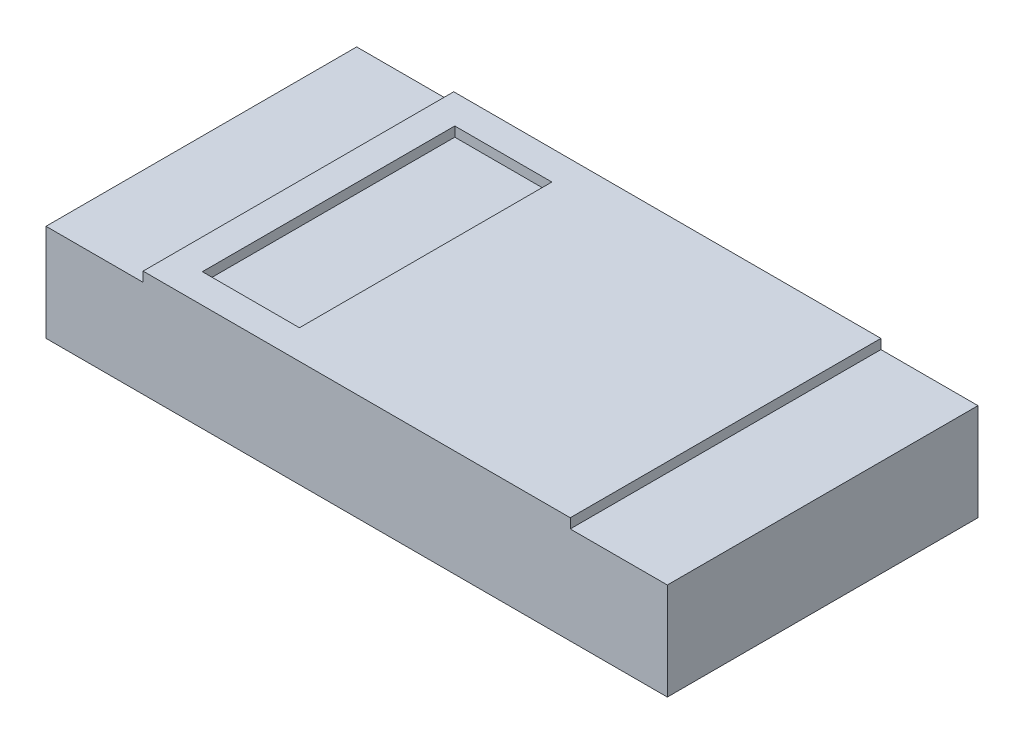
ISO-10303-21;
HEADER;
FILE_DESCRIPTION(('STEP AP214'),'2;1');
FILE_NAME('part.step','',(''),(''),'','','');
FILE_SCHEMA(('AUTOMOTIVE_DESIGN { 1 0 10303 214 1 1 1 1 }'));
ENDSEC;
DATA;
#1=APPLICATION_CONTEXT('core data for automotive mechanical design processes');
#2=APPLICATION_PROTOCOL_DEFINITION('international standard','automotive_design',2000,#1);
#3=PRODUCT_CONTEXT('',#1,'mechanical');
#4=PRODUCT('Part','Part','',(#3));
#5=PRODUCT_RELATED_PRODUCT_CATEGORY('part','',(#4));
#6=PRODUCT_DEFINITION_FORMATION('','',#4);
#7=PRODUCT_DEFINITION_CONTEXT('part definition',#1,'design');
#8=PRODUCT_DEFINITION('design','',#6,#7);
#9=PRODUCT_DEFINITION_SHAPE('','',#8);
#10=(LENGTH_UNIT() NAMED_UNIT(*) SI_UNIT(.MILLI.,.METRE.));
#11=(NAMED_UNIT(*) PLANE_ANGLE_UNIT() SI_UNIT($,.RADIAN.));
#12=(NAMED_UNIT(*) SI_UNIT($,.STERADIAN.) SOLID_ANGLE_UNIT());
#13=UNCERTAINTY_MEASURE_WITH_UNIT(LENGTH_MEASURE(1.E-05),#10,'distance_accuracy_value','');
#14=(GEOMETRIC_REPRESENTATION_CONTEXT(3) GLOBAL_UNCERTAINTY_ASSIGNED_CONTEXT((#13)) GLOBAL_UNIT_ASSIGNED_CONTEXT((#10,
#11,#12)) REPRESENTATION_CONTEXT('',''));
#15=CARTESIAN_POINT('',(0.,0.,0.));
#16=DIRECTION('',(0.,0.,1.));
#17=DIRECTION('',(1.,0.,0.));
#18=AXIS2_PLACEMENT_3D('',#15,#16,#17);
#19=CARTESIAN_POINT('',(0.,0.5,0.));
#20=DIRECTION('',(0.,-1.,0.));
#21=DIRECTION('',(0.,0.,-1.));
#22=AXIS2_PLACEMENT_3D('',#19,#20,#21);
#23=PLANE('',#22);
#24=DIRECTION('',(0.,0.,1.));
#25=VECTOR('',#24,1.);
#26=CARTESIAN_POINT('',(-1.1,0.5,-0.8));
#27=LINE('',#26,#25);
#28=CARTESIAN_POINT('',(-1.1,0.5,-0.8));
#29=VERTEX_POINT('',#28);
#30=CARTESIAN_POINT('',(-1.1,0.5,0.8));
#31=VERTEX_POINT('',#30);
#32=EDGE_CURVE('E176',#29,#31,#27,.T.);
#33=ORIENTED_EDGE('',*,*,#32,.F.);
#34=DIRECTION('',(-1.,0.,0.));
#35=VECTOR('',#34,1.);
#36=CARTESIAN_POINT('',(-1.6,0.5,-0.8));
#37=LINE('',#36,#35);
#38=CARTESIAN_POINT('',(-1.6,0.5,-0.8));
#39=VERTEX_POINT('',#38);
#40=EDGE_CURVE('E221',#29,#39,#37,.T.);
#41=ORIENTED_EDGE('',*,*,#40,.T.);
#42=DIRECTION('',(0.,0.,1.));
#43=VECTOR('',#42,1.);
#44=CARTESIAN_POINT('',(-1.6,0.5,0.8));
#45=LINE('',#44,#43);
#46=CARTESIAN_POINT('',(-1.6,0.5,0.8));
#47=VERTEX_POINT('',#46);
#48=EDGE_CURVE('E226',#39,#47,#45,.T.);
#49=ORIENTED_EDGE('',*,*,#48,.T.);
#50=DIRECTION('',(1.,0.,0.));
#51=VECTOR('',#50,1.);
#52=CARTESIAN_POINT('',(-1.6,0.5,0.8));
#53=LINE('',#52,#51);
#54=EDGE_CURVE('E230',#47,#31,#53,.T.);
#55=ORIENTED_EDGE('',*,*,#54,.T.);
#56=EDGE_LOOP('',(#33,#41,#49,#55));
#57=FACE_BOUND('',#56,.T.);
#58=ADVANCED_FACE('F41',(#57),#23,.F.);
#59=DIRECTION('',(0.,0.,-1.));
#60=VECTOR('',#59,1.);
#61=CARTESIAN_POINT('',(1.1,0.5,-0.800000000000001));
#62=LINE('',#61,#60);
#63=CARTESIAN_POINT('',(1.1,0.5,0.8));
#64=VERTEX_POINT('',#63);
#65=CARTESIAN_POINT('',(1.1,0.5,-0.800000000000001));
#66=VERTEX_POINT('',#65);
#67=EDGE_CURVE('E65',#64,#66,#62,.T.);
#68=ORIENTED_EDGE('',*,*,#67,.F.);
#69=CARTESIAN_POINT('',(1.6,0.5,0.8));
#70=VERTEX_POINT('',#69);
#71=EDGE_CURVE('E229',#64,#70,#53,.T.);
#72=ORIENTED_EDGE('',*,*,#71,.T.);
#73=DIRECTION('',(0.,0.,-1.));
#74=VECTOR('',#73,1.);
#75=CARTESIAN_POINT('',(1.6,0.5,0.8));
#76=LINE('',#75,#74);
#77=CARTESIAN_POINT('',(1.6,0.5,-0.8));
#78=VERTEX_POINT('',#77);
#79=EDGE_CURVE('E217',#70,#78,#76,.T.);
#80=ORIENTED_EDGE('',*,*,#79,.T.);
#81=EDGE_CURVE('E223',#78,#66,#37,.T.);
#82=ORIENTED_EDGE('',*,*,#81,.T.);
#83=EDGE_LOOP('',(#68,#72,#80,#82));
#84=FACE_BOUND('',#83,.T.);
#85=ADVANCED_FACE('F272',(#84),#23,.F.);
#86=CARTESIAN_POINT('',(1.6,0.5,0.8));
#87=DIRECTION('',(-1.,0.,0.));
#88=DIRECTION('',(0.,0.,1.));
#89=AXIS2_PLACEMENT_3D('',#86,#87,#88);
#90=PLANE('',#89);
#91=DIRECTION('',(0.,0.,-1.));
#92=VECTOR('',#91,1.);
#93=CARTESIAN_POINT('',(1.6,0.,0.8));
#94=LINE('',#93,#92);
#95=CARTESIAN_POINT('',(1.6,0.,0.8));
#96=VERTEX_POINT('',#95);
#97=CARTESIAN_POINT('',(1.6,0.,-0.8));
#98=VERTEX_POINT('',#97);
#99=EDGE_CURVE('E216',#96,#98,#94,.T.);
#100=ORIENTED_EDGE('',*,*,#99,.T.);
#101=DIRECTION('',(0.,-1.,0.));
#102=VECTOR('',#101,1.);
#103=CARTESIAN_POINT('',(1.6,0.5,-0.8));
#104=LINE('',#103,#102);
#105=EDGE_CURVE('E11',#78,#98,#104,.T.);
#106=ORIENTED_EDGE('',*,*,#105,.F.);
#107=ORIENTED_EDGE('',*,*,#79,.F.);
#108=DIRECTION('',(0.,-1.,0.));
#109=VECTOR('',#108,1.);
#110=CARTESIAN_POINT('',(1.6,0.5,0.8));
#111=LINE('',#110,#109);
#112=EDGE_CURVE('E233',#70,#96,#111,.T.);
#113=ORIENTED_EDGE('',*,*,#112,.T.);
#114=EDGE_LOOP('',(#100,#106,#107,#113));
#115=FACE_BOUND('',#114,.T.);
#116=ADVANCED_FACE('F43',(#115),#90,.F.);
#117=CARTESIAN_POINT('',(-1.6,0.5,-0.8));
#118=DIRECTION('',(0.,0.,1.));
#119=DIRECTION('',(1.,0.,0.));
#120=AXIS2_PLACEMENT_3D('',#117,#118,#119);
#121=PLANE('',#120);
#122=DIRECTION('',(-1.,0.,0.));
#123=VECTOR('',#122,1.);
#124=CARTESIAN_POINT('',(-1.6,0.,-0.8));
#125=LINE('',#124,#123);
#126=CARTESIAN_POINT('',(-1.6,0.,-0.8));
#127=VERTEX_POINT('',#126);
#128=EDGE_CURVE('E237',#98,#127,#125,.T.);
#129=ORIENTED_EDGE('',*,*,#128,.T.);
#130=DIRECTION('',(0.,-1.,0.));
#131=VECTOR('',#130,1.);
#132=CARTESIAN_POINT('',(-1.6,0.5,-0.8));
#133=LINE('',#132,#131);
#134=EDGE_CURVE('E50',#39,#127,#133,.T.);
#135=ORIENTED_EDGE('',*,*,#134,.F.);
#136=ORIENTED_EDGE('',*,*,#40,.F.);
#137=DIRECTION('',(0.,-1.,0.));
#138=VECTOR('',#137,1.);
#139=CARTESIAN_POINT('',(-1.1,0.55,-0.8));
#140=LINE('',#139,#138);
#141=CARTESIAN_POINT('',(-1.1,0.55,-0.8));
#142=VERTEX_POINT('',#141);
#143=EDGE_CURVE('E195',#142,#29,#140,.T.);
#144=ORIENTED_EDGE('',*,*,#143,.F.);
#145=DIRECTION('',(-1.,0.,0.));
#146=VECTOR('',#145,1.);
#147=CARTESIAN_POINT('',(-1.1,0.55,-0.8));
#148=LINE('',#147,#146);
#149=CARTESIAN_POINT('',(1.1,0.55,-0.800000000000001));
#150=VERTEX_POINT('',#149);
#151=EDGE_CURVE('E192',#150,#142,#148,.T.);
#152=ORIENTED_EDGE('',*,*,#151,.F.);
#153=DIRECTION('',(0.,-1.,0.));
#154=VECTOR('',#153,1.);
#155=CARTESIAN_POINT('',(1.1,0.55,-0.800000000000001));
#156=LINE('',#155,#154);
#157=EDGE_CURVE('E204',#150,#66,#156,.T.);
#158=ORIENTED_EDGE('',*,*,#157,.T.);
#159=ORIENTED_EDGE('',*,*,#81,.F.);
#160=ORIENTED_EDGE('',*,*,#105,.T.);
#161=EDGE_LOOP('',(#129,#135,#136,#144,#152,#158,#159,#160));
#162=FACE_BOUND('',#161,.T.);
#163=ADVANCED_FACE('F278',(#162),#121,.F.);
#164=CARTESIAN_POINT('',(-1.6,0.5,0.8));
#165=DIRECTION('',(1.,0.,0.));
#166=DIRECTION('',(0.,0.,-1.));
#167=AXIS2_PLACEMENT_3D('',#164,#165,#166);
#168=PLANE('',#167);
#169=DIRECTION('',(0.,0.,1.));
#170=VECTOR('',#169,1.);
#171=CARTESIAN_POINT('',(-1.6,0.,0.8));
#172=LINE('',#171,#170);
#173=CARTESIAN_POINT('',(-1.6,0.,0.8));
#174=VERTEX_POINT('',#173);
#175=EDGE_CURVE('E240',#127,#174,#172,.T.);
#176=ORIENTED_EDGE('',*,*,#175,.T.);
#177=DIRECTION('',(0.,-1.,0.));
#178=VECTOR('',#177,1.);
#179=CARTESIAN_POINT('',(-1.6,0.5,0.8));
#180=LINE('',#179,#178);
#181=EDGE_CURVE('E248',#47,#174,#180,.T.);
#182=ORIENTED_EDGE('',*,*,#181,.F.);
#183=ORIENTED_EDGE('',*,*,#48,.F.);
#184=ORIENTED_EDGE('',*,*,#134,.T.);
#185=EDGE_LOOP('',(#176,#182,#183,#184));
#186=FACE_BOUND('',#185,.T.);
#187=ADVANCED_FACE('F257',(#186),#168,.F.);
#188=CARTESIAN_POINT('',(-1.6,0.5,0.8));
#189=DIRECTION('',(0.,0.,-1.));
#190=DIRECTION('',(-1.,0.,0.));
#191=AXIS2_PLACEMENT_3D('',#188,#189,#190);
#192=PLANE('',#191);
#193=DIRECTION('',(1.,0.,0.));
#194=VECTOR('',#193,1.);
#195=CARTESIAN_POINT('',(-1.6,0.,0.8));
#196=LINE('',#195,#194);
#197=EDGE_CURVE('E222',#174,#96,#196,.T.);
#198=ORIENTED_EDGE('',*,*,#197,.T.);
#199=ORIENTED_EDGE('',*,*,#112,.F.);
#200=ORIENTED_EDGE('',*,*,#71,.F.);
#201=DIRECTION('',(0.,-1.,0.));
#202=VECTOR('',#201,1.);
#203=CARTESIAN_POINT('',(1.1,0.55,0.8));
#204=LINE('',#203,#202);
#205=CARTESIAN_POINT('',(1.1,0.55,0.8));
#206=VERTEX_POINT('',#205);
#207=EDGE_CURVE('E208',#206,#64,#204,.T.);
#208=ORIENTED_EDGE('',*,*,#207,.F.);
#209=DIRECTION('',(1.,0.,0.));
#210=VECTOR('',#209,1.);
#211=CARTESIAN_POINT('',(-1.1,0.55,0.8));
#212=LINE('',#211,#210);
#213=CARTESIAN_POINT('',(-1.1,0.55,0.8));
#214=VERTEX_POINT('',#213);
#215=EDGE_CURVE('E186',#214,#206,#212,.T.);
#216=ORIENTED_EDGE('',*,*,#215,.F.);
#217=DIRECTION('',(0.,-1.,0.));
#218=VECTOR('',#217,1.);
#219=CARTESIAN_POINT('',(-1.1,0.55,0.8));
#220=LINE('',#219,#218);
#221=EDGE_CURVE('E212',#214,#31,#220,.T.);
#222=ORIENTED_EDGE('',*,*,#221,.T.);
#223=ORIENTED_EDGE('',*,*,#54,.F.);
#224=ORIENTED_EDGE('',*,*,#181,.T.);
#225=EDGE_LOOP('',(#198,#199,#200,#208,#216,#222,#223,#224));
#226=FACE_BOUND('',#225,.T.);
#227=ADVANCED_FACE('F267',(#226),#192,.F.);
#228=CARTESIAN_POINT('',(0.,0.,0.));
#229=DIRECTION('',(0.,-1.,0.));
#230=DIRECTION('',(0.,0.,-1.));
#231=AXIS2_PLACEMENT_3D('',#228,#229,#230);
#232=PLANE('',#231);
#233=ORIENTED_EDGE('',*,*,#99,.F.);
#234=ORIENTED_EDGE('',*,*,#197,.F.);
#235=ORIENTED_EDGE('',*,*,#175,.F.);
#236=ORIENTED_EDGE('',*,*,#128,.F.);
#237=EDGE_LOOP('',(#233,#234,#235,#236));
#238=FACE_BOUND('',#237,.T.);
#239=ADVANCED_FACE('F264',(#238),#232,.T.);
#240=CARTESIAN_POINT('',(-1.1,0.55,-0.8));
#241=DIRECTION('',(1.,0.,0.));
#242=DIRECTION('',(0.,0.,-1.));
#243=AXIS2_PLACEMENT_3D('',#240,#241,#242);
#244=PLANE('',#243);
#245=ORIENTED_EDGE('',*,*,#32,.T.);
#246=ORIENTED_EDGE('',*,*,#221,.F.);
#247=DIRECTION('',(0.,0.,1.));
#248=VECTOR('',#247,1.);
#249=CARTESIAN_POINT('',(-1.1,0.55,-0.8));
#250=LINE('',#249,#248);
#251=EDGE_CURVE('E182',#142,#214,#250,.T.);
#252=ORIENTED_EDGE('',*,*,#251,.F.);
#253=ORIENTED_EDGE('',*,*,#143,.T.);
#254=EDGE_LOOP('',(#245,#246,#252,#253));
#255=FACE_BOUND('',#254,.T.);
#256=ADVANCED_FACE('F282',(#255),#244,.F.);
#257=CARTESIAN_POINT('',(1.1,0.55,-0.800000000000001));
#258=DIRECTION('',(-1.,0.,0.));
#259=DIRECTION('',(0.,0.,1.));
#260=AXIS2_PLACEMENT_3D('',#257,#258,#259);
#261=PLANE('',#260);
#262=ORIENTED_EDGE('',*,*,#67,.T.);
#263=ORIENTED_EDGE('',*,*,#157,.F.);
#264=DIRECTION('',(0.,0.,-1.));
#265=VECTOR('',#264,1.);
#266=CARTESIAN_POINT('',(1.1,0.55,-0.800000000000001));
#267=LINE('',#266,#265);
#268=EDGE_CURVE('E189',#206,#150,#267,.T.);
#269=ORIENTED_EDGE('',*,*,#268,.F.);
#270=ORIENTED_EDGE('',*,*,#207,.T.);
#271=EDGE_LOOP('',(#262,#263,#269,#270));
#272=FACE_BOUND('',#271,.T.);
#273=ADVANCED_FACE('F289',(#272),#261,.F.);
#274=CARTESIAN_POINT('',(0.,0.55,0.));
#275=DIRECTION('',(0.,1.,0.));
#276=DIRECTION('',(0.,0.,1.));
#277=AXIS2_PLACEMENT_3D('',#274,#275,#276);
#278=PLANE('',#277);
#279=DIRECTION('',(0.,0.,1.));
#280=VECTOR('',#279,1.);
#281=CARTESIAN_POINT('',(-0.944727382755866,0.55,-0.65));
#282=LINE('',#281,#280);
#283=CARTESIAN_POINT('',(-0.944727382755866,0.55,-0.65));
#284=VERTEX_POINT('',#283);
#285=CARTESIAN_POINT('',(-0.944727382755866,0.55,0.65));
#286=VERTEX_POINT('',#285);
#287=EDGE_CURVE('E57',#284,#286,#282,.T.);
#288=ORIENTED_EDGE('',*,*,#287,.F.);
#289=DIRECTION('',(-1.,0.,0.));
#290=VECTOR('',#289,1.);
#291=CARTESIAN_POINT('',(-0.944727382755866,0.55,-0.65));
#292=LINE('',#291,#290);
#293=CARTESIAN_POINT('',(-0.444727382755866,0.55,-0.65));
#294=VERTEX_POINT('',#293);
#295=EDGE_CURVE('E154',#294,#284,#292,.T.);
#296=ORIENTED_EDGE('',*,*,#295,.F.);
#297=DIRECTION('',(0.,0.,-1.));
#298=VECTOR('',#297,1.);
#299=CARTESIAN_POINT('',(-0.444727382755866,0.55,-0.65));
#300=LINE('',#299,#298);
#301=CARTESIAN_POINT('',(-0.444727382755866,0.55,0.65));
#302=VERTEX_POINT('',#301);
#303=EDGE_CURVE('E158',#302,#294,#300,.T.);
#304=ORIENTED_EDGE('',*,*,#303,.F.);
#305=DIRECTION('',(1.,0.,0.));
#306=VECTOR('',#305,1.);
#307=CARTESIAN_POINT('',(-0.944727382755866,0.55,0.65));
#308=LINE('',#307,#306);
#309=EDGE_CURVE('E167',#286,#302,#308,.T.);
#310=ORIENTED_EDGE('',*,*,#309,.F.);
#311=EDGE_LOOP('',(#288,#296,#304,#310));
#312=FACE_BOUND('',#311,.T.);
#313=ORIENTED_EDGE('',*,*,#251,.T.);
#314=ORIENTED_EDGE('',*,*,#215,.T.);
#315=ORIENTED_EDGE('',*,*,#268,.T.);
#316=ORIENTED_EDGE('',*,*,#151,.T.);
#317=EDGE_LOOP('',(#313,#314,#315,#316));
#318=FACE_BOUND('',#317,.T.);
#319=ADVANCED_FACE('F285',(#312,#318),#278,.T.);
#320=CARTESIAN_POINT('',(-0.944727382755866,0.5,-0.65));
#321=DIRECTION('',(-1.,0.,0.));
#322=DIRECTION('',(0.,0.,1.));
#323=AXIS2_PLACEMENT_3D('',#320,#321,#322);
#324=PLANE('',#323);
#325=ORIENTED_EDGE('',*,*,#287,.T.);
#326=DIRECTION('',(0.,1.,0.));
#327=VECTOR('',#326,1.);
#328=CARTESIAN_POINT('',(-0.944727382755866,0.5,0.65));
#329=LINE('',#328,#327);
#330=CARTESIAN_POINT('',(-0.944727382755866,0.5,0.65));
#331=VERTEX_POINT('',#330);
#332=EDGE_CURVE('E129',#331,#286,#329,.T.);
#333=ORIENTED_EDGE('',*,*,#332,.F.);
#334=DIRECTION('',(0.,0.,1.));
#335=VECTOR('',#334,1.);
#336=CARTESIAN_POINT('',(-0.944727382755866,0.5,-0.65));
#337=LINE('',#336,#335);
#338=CARTESIAN_POINT('',(-0.944727382755866,0.5,-0.65));
#339=VERTEX_POINT('',#338);
#340=EDGE_CURVE('E133',#339,#331,#337,.T.);
#341=ORIENTED_EDGE('',*,*,#340,.F.);
#342=DIRECTION('',(0.,1.,0.));
#343=VECTOR('',#342,1.);
#344=CARTESIAN_POINT('',(-0.944727382755866,0.5,-0.65));
#345=LINE('',#344,#343);
#346=EDGE_CURVE('E173',#339,#284,#345,.T.);
#347=ORIENTED_EDGE('',*,*,#346,.T.);
#348=EDGE_LOOP('',(#325,#333,#341,#347));
#349=FACE_BOUND('',#348,.T.);
#350=ADVANCED_FACE('F131',(#349),#324,.F.);
#351=CARTESIAN_POINT('',(-0.944727382755866,0.5,-0.65));
#352=DIRECTION('',(0.,0.,-1.));
#353=DIRECTION('',(-1.,0.,0.));
#354=AXIS2_PLACEMENT_3D('',#351,#352,#353);
#355=PLANE('',#354);
#356=ORIENTED_EDGE('',*,*,#295,.T.);
#357=ORIENTED_EDGE('',*,*,#346,.F.);
#358=DIRECTION('',(-1.,0.,0.));
#359=VECTOR('',#358,1.);
#360=CARTESIAN_POINT('',(-0.944727382755866,0.5,-0.65));
#361=LINE('',#360,#359);
#362=CARTESIAN_POINT('',(-0.444727382755866,0.5,-0.65));
#363=VERTEX_POINT('',#362);
#364=EDGE_CURVE('E140',#363,#339,#361,.T.);
#365=ORIENTED_EDGE('',*,*,#364,.F.);
#366=DIRECTION('',(0.,1.,0.));
#367=VECTOR('',#366,1.);
#368=CARTESIAN_POINT('',(-0.444727382755866,0.5,-0.65));
#369=LINE('',#368,#367);
#370=EDGE_CURVE('E177',#363,#294,#369,.T.);
#371=ORIENTED_EDGE('',*,*,#370,.T.);
#372=EDGE_LOOP('',(#356,#357,#365,#371));
#373=FACE_BOUND('',#372,.T.);
#374=ADVANCED_FACE('F369',(#373),#355,.F.);
#375=CARTESIAN_POINT('',(-0.444727382755866,0.5,-0.65));
#376=DIRECTION('',(1.,0.,0.));
#377=DIRECTION('',(0.,0.,-1.));
#378=AXIS2_PLACEMENT_3D('',#375,#376,#377);
#379=PLANE('',#378);
#380=ORIENTED_EDGE('',*,*,#303,.T.);
#381=ORIENTED_EDGE('',*,*,#370,.F.);
#382=DIRECTION('',(0.,0.,-1.));
#383=VECTOR('',#382,1.);
#384=CARTESIAN_POINT('',(-0.444727382755866,0.5,-0.65));
#385=LINE('',#384,#383);
#386=CARTESIAN_POINT('',(-0.444727382755866,0.5,0.65));
#387=VERTEX_POINT('',#386);
#388=EDGE_CURVE('E149',#387,#363,#385,.T.);
#389=ORIENTED_EDGE('',*,*,#388,.F.);
#390=DIRECTION('',(0.,1.,0.));
#391=VECTOR('',#390,1.);
#392=CARTESIAN_POINT('',(-0.444727382755866,0.5,0.65));
#393=LINE('',#392,#391);
#394=EDGE_CURVE('E139',#387,#302,#393,.T.);
#395=ORIENTED_EDGE('',*,*,#394,.T.);
#396=EDGE_LOOP('',(#380,#381,#389,#395));
#397=FACE_BOUND('',#396,.T.);
#398=ADVANCED_FACE('F378',(#397),#379,.F.);
#399=CARTESIAN_POINT('',(-0.944727382755866,0.5,0.65));
#400=DIRECTION('',(0.,0.,1.));
#401=DIRECTION('',(1.,0.,0.));
#402=AXIS2_PLACEMENT_3D('',#399,#400,#401);
#403=PLANE('',#402);
#404=ORIENTED_EDGE('',*,*,#309,.T.);
#405=ORIENTED_EDGE('',*,*,#394,.F.);
#406=DIRECTION('',(1.,0.,0.));
#407=VECTOR('',#406,1.);
#408=CARTESIAN_POINT('',(-0.944727382755866,0.5,0.65));
#409=LINE('',#408,#407);
#410=EDGE_CURVE('E143',#331,#387,#409,.T.);
#411=ORIENTED_EDGE('',*,*,#410,.F.);
#412=ORIENTED_EDGE('',*,*,#332,.T.);
#413=EDGE_LOOP('',(#404,#405,#411,#412));
#414=FACE_BOUND('',#413,.T.);
#415=ADVANCED_FACE('F144',(#414),#403,.F.);
#416=CARTESIAN_POINT('',(0.,0.5,0.));
#417=DIRECTION('',(0.,1.,0.));
#418=DIRECTION('',(0.,0.,1.));
#419=AXIS2_PLACEMENT_3D('',#416,#417,#418);
#420=PLANE('',#419);
#421=ORIENTED_EDGE('',*,*,#340,.T.);
#422=ORIENTED_EDGE('',*,*,#410,.T.);
#423=ORIENTED_EDGE('',*,*,#388,.T.);
#424=ORIENTED_EDGE('',*,*,#364,.T.);
#425=EDGE_LOOP('',(#421,#422,#423,#424));
#426=FACE_BOUND('',#425,.T.);
#427=ADVANCED_FACE('F151',(#426),#420,.T.);
#428=CLOSED_SHELL('',(#58,#85,#116,#163,#187,#227,#239,#256,#273,#319,#350,#374,#398,#415,#427));
#429=MANIFOLD_SOLID_BREP('B2',#428);
#430=ADVANCED_BREP_SHAPE_REPRESENTATION('',(#18,#429),#14);
#431=SHAPE_DEFINITION_REPRESENTATION(#9,#430);
ENDSEC;
END-ISO-10303-21;
